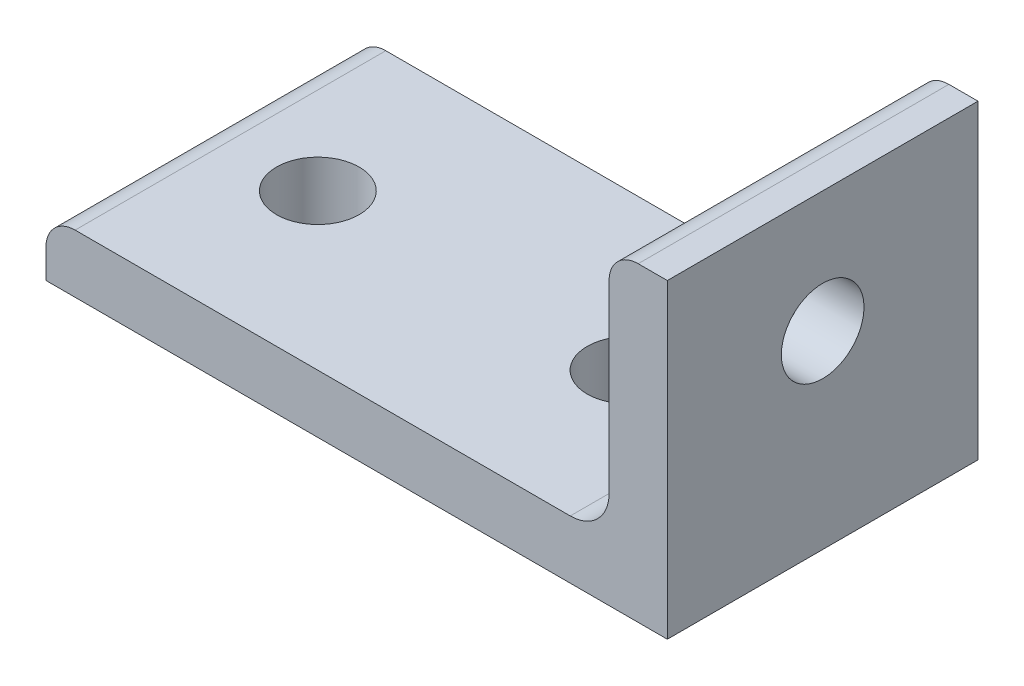
ISO-10303-21;
HEADER;
FILE_DESCRIPTION(('STEP AP214'),'2;1');
FILE_NAME('part.step','',(''),(''),'','','');
FILE_SCHEMA(('AUTOMOTIVE_DESIGN { 1 0 10303 214 1 1 1 1 }'));
ENDSEC;
DATA;
#1=APPLICATION_CONTEXT('core data for automotive mechanical design processes');
#2=APPLICATION_PROTOCOL_DEFINITION('international standard','automotive_design',2000,#1);
#3=PRODUCT_CONTEXT('',#1,'mechanical');
#4=PRODUCT('Part','Part','',(#3));
#5=PRODUCT_RELATED_PRODUCT_CATEGORY('part','',(#4));
#6=PRODUCT_DEFINITION_FORMATION('','',#4);
#7=PRODUCT_DEFINITION_CONTEXT('part definition',#1,'design');
#8=PRODUCT_DEFINITION('design','',#6,#7);
#9=PRODUCT_DEFINITION_SHAPE('','',#8);
#10=(LENGTH_UNIT() NAMED_UNIT(*) SI_UNIT(.MILLI.,.METRE.));
#11=(NAMED_UNIT(*) PLANE_ANGLE_UNIT() SI_UNIT($,.RADIAN.));
#12=(NAMED_UNIT(*) SI_UNIT($,.STERADIAN.) SOLID_ANGLE_UNIT());
#13=UNCERTAINTY_MEASURE_WITH_UNIT(LENGTH_MEASURE(1.E-05),#10,'distance_accuracy_value','');
#14=(GEOMETRIC_REPRESENTATION_CONTEXT(3) GLOBAL_UNCERTAINTY_ASSIGNED_CONTEXT((#13)) GLOBAL_UNIT_ASSIGNED_CONTEXT((#10,
#11,#12)) REPRESENTATION_CONTEXT('',''));
#15=CARTESIAN_POINT('',(0.,0.,0.));
#16=DIRECTION('',(0.,0.,1.));
#17=DIRECTION('',(1.,0.,0.));
#18=AXIS2_PLACEMENT_3D('',#15,#16,#17);
#19=CARTESIAN_POINT('',(-25.4,-10.31875,12.7));
#20=DIRECTION('',(1.,0.,0.));
#21=DIRECTION('',(0.,0.,-1.));
#22=AXIS2_PLACEMENT_3D('',#19,#20,#21);
#23=PLANE('',#22);
#24=DIRECTION('',(0.,-1.,0.));
#25=VECTOR('',#24,1.);
#26=CARTESIAN_POINT('',(-25.4,-10.31875,-12.7));
#27=LINE('',#26,#25);
#28=CARTESIAN_POINT('',(-25.4,-10.31875,-12.7));
#29=VERTEX_POINT('',#28);
#30=CARTESIAN_POINT('',(-25.4,-12.7,-12.7));
#31=VERTEX_POINT('',#30);
#32=EDGE_CURVE('E145',#29,#31,#27,.T.);
#33=ORIENTED_EDGE('',*,*,#32,.T.);
#34=DIRECTION('',(0.,0.,-1.));
#35=VECTOR('',#34,1.);
#36=CARTESIAN_POINT('',(-25.4,-12.7,12.7));
#37=LINE('',#36,#35);
#38=CARTESIAN_POINT('',(-25.4,-12.7,12.7));
#39=VERTEX_POINT('',#38);
#40=EDGE_CURVE('E11',#39,#31,#37,.T.);
#41=ORIENTED_EDGE('',*,*,#40,.F.);
#42=DIRECTION('',(0.,-1.,0.));
#43=VECTOR('',#42,1.);
#44=CARTESIAN_POINT('',(-25.4,-10.31875,12.7));
#45=LINE('',#44,#43);
#46=CARTESIAN_POINT('',(-25.4,-10.31875,12.7));
#47=VERTEX_POINT('',#46);
#48=EDGE_CURVE('E162',#47,#39,#45,.T.);
#49=ORIENTED_EDGE('',*,*,#48,.F.);
#50=DIRECTION('',(0.,0.,-1.));
#51=VECTOR('',#50,1.);
#52=CARTESIAN_POINT('',(-25.4,-10.31875,12.7));
#53=LINE('',#52,#51);
#54=EDGE_CURVE('E141',#47,#29,#53,.T.);
#55=ORIENTED_EDGE('',*,*,#54,.T.);
#56=EDGE_LOOP('',(#33,#41,#49,#55));
#57=FACE_BOUND('',#56,.T.);
#58=ADVANCED_FACE('F43',(#57),#23,.F.);
#59=CARTESIAN_POINT('',(-25.4,-12.7,12.7));
#60=DIRECTION('',(0.,1.,0.));
#61=DIRECTION('',(-1.,0.,0.));
#62=AXIS2_PLACEMENT_3D('',#59,#60,#61);
#63=PLANE('',#62);
#64=CARTESIAN_POINT('',(-15.875,-12.7,0.));
#65=DIRECTION('',(0.,1.,0.));
#66=DIRECTION('',(0.,0.,1.));
#67=AXIS2_PLACEMENT_3D('',#64,#65,#66);
#68=CIRCLE('',#67,3.3782);
#69=CARTESIAN_POINT('',(-15.875,-12.7,3.3782));
#70=VERTEX_POINT('',#69);
#71=EDGE_CURVE('E214',#70,#70,#68,.T.);
#72=ORIENTED_EDGE('',*,*,#71,.T.);
#73=EDGE_LOOP('',(#72));
#74=FACE_BOUND('',#73,.T.);
#75=CARTESIAN_POINT('',(9.525,-12.7,0.));
#76=DIRECTION('',(0.,1.,0.));
#77=DIRECTION('',(0.,0.,1.));
#78=AXIS2_PLACEMENT_3D('',#75,#76,#77);
#79=CIRCLE('',#78,3.3782);
#80=CARTESIAN_POINT('',(9.525,-12.7,3.3782));
#81=VERTEX_POINT('',#80);
#82=EDGE_CURVE('E208',#81,#81,#79,.T.);
#83=ORIENTED_EDGE('',*,*,#82,.T.);
#84=EDGE_LOOP('',(#83));
#85=FACE_BOUND('',#84,.T.);
#86=DIRECTION('',(1.,0.,0.));
#87=VECTOR('',#86,1.);
#88=CARTESIAN_POINT('',(-25.4,-12.7,-12.7));
#89=LINE('',#88,#87);
#90=CARTESIAN_POINT('',(25.4,-12.7,-12.7));
#91=VERTEX_POINT('',#90);
#92=EDGE_CURVE('E148',#31,#91,#89,.T.);
#93=ORIENTED_EDGE('',*,*,#92,.T.);
#94=DIRECTION('',(0.,0.,-1.));
#95=VECTOR('',#94,1.);
#96=CARTESIAN_POINT('',(25.4,-12.7,12.7));
#97=LINE('',#96,#95);
#98=CARTESIAN_POINT('',(25.4,-12.7,12.7));
#99=VERTEX_POINT('',#98);
#100=EDGE_CURVE('E51',#99,#91,#97,.T.);
#101=ORIENTED_EDGE('',*,*,#100,.F.);
#102=DIRECTION('',(1.,0.,0.));
#103=VECTOR('',#102,1.);
#104=CARTESIAN_POINT('',(-25.4,-12.7,12.7));
#105=LINE('',#104,#103);
#106=EDGE_CURVE('E105',#39,#99,#105,.T.);
#107=ORIENTED_EDGE('',*,*,#106,.F.);
#108=ORIENTED_EDGE('',*,*,#40,.T.);
#109=EDGE_LOOP('',(#93,#101,#107,#108));
#110=FACE_BOUND('',#109,.T.);
#111=ADVANCED_FACE('F244',(#74,#85,#110),#63,.F.);
#112=CARTESIAN_POINT('',(25.4,-12.7,12.7));
#113=DIRECTION('',(-1.,0.,0.));
#114=DIRECTION('',(0.,-1.,0.));
#115=AXIS2_PLACEMENT_3D('',#112,#113,#114);
#116=PLANE('',#115);
#117=CARTESIAN_POINT('',(25.4,2.778125,0.));
#118=DIRECTION('',(-1.,0.,0.));
#119=DIRECTION('',(0.,0.,1.));
#120=AXIS2_PLACEMENT_3D('',#117,#118,#119);
#121=CIRCLE('',#120,3.3782);
#122=CARTESIAN_POINT('',(25.4,2.778125,3.3782));
#123=VERTEX_POINT('',#122);
#124=EDGE_CURVE('E149',#123,#123,#121,.T.);
#125=ORIENTED_EDGE('',*,*,#124,.T.);
#126=EDGE_LOOP('',(#125));
#127=FACE_BOUND('',#126,.T.);
#128=DIRECTION('',(0.,1.,0.));
#129=VECTOR('',#128,1.);
#130=CARTESIAN_POINT('',(25.4,-12.7,-12.7));
#131=LINE('',#130,#129);
#132=CARTESIAN_POINT('',(25.4,12.7,-12.7));
#133=VERTEX_POINT('',#132);
#134=EDGE_CURVE('E151',#91,#133,#131,.T.);
#135=ORIENTED_EDGE('',*,*,#134,.T.);
#136=DIRECTION('',(0.,0.,-1.));
#137=VECTOR('',#136,1.);
#138=CARTESIAN_POINT('',(25.4,12.7,12.7));
#139=LINE('',#138,#137);
#140=CARTESIAN_POINT('',(25.4,12.7,12.7));
#141=VERTEX_POINT('',#140);
#142=EDGE_CURVE('E172',#141,#133,#139,.T.);
#143=ORIENTED_EDGE('',*,*,#142,.F.);
#144=DIRECTION('',(0.,1.,0.));
#145=VECTOR('',#144,1.);
#146=CARTESIAN_POINT('',(25.4,-12.7,12.7));
#147=LINE('',#146,#145);
#148=EDGE_CURVE('E180',#99,#141,#147,.T.);
#149=ORIENTED_EDGE('',*,*,#148,.F.);
#150=ORIENTED_EDGE('',*,*,#100,.T.);
#151=EDGE_LOOP('',(#135,#143,#149,#150));
#152=FACE_BOUND('',#151,.T.);
#153=ADVANCED_FACE('F178',(#127,#152),#116,.F.);
#154=CARTESIAN_POINT('',(23.01875,12.7,12.7));
#155=DIRECTION('',(0.,-1.,0.));
#156=DIRECTION('',(0.,0.,-1.));
#157=AXIS2_PLACEMENT_3D('',#154,#155,#156);
#158=PLANE('',#157);
#159=DIRECTION('',(-1.,0.,0.));
#160=VECTOR('',#159,1.);
#161=CARTESIAN_POINT('',(23.01875,12.7,-12.7));
#162=LINE('',#161,#160);
#163=CARTESIAN_POINT('',(23.01875,12.7,-12.7));
#164=VERTEX_POINT('',#163);
#165=EDGE_CURVE('E153',#133,#164,#162,.T.);
#166=ORIENTED_EDGE('',*,*,#165,.T.);
#167=DIRECTION('',(0.,0.,-1.));
#168=VECTOR('',#167,1.);
#169=CARTESIAN_POINT('',(23.01875,12.7,12.7));
#170=LINE('',#169,#168);
#171=CARTESIAN_POINT('',(23.01875,12.7,12.7));
#172=VERTEX_POINT('',#171);
#173=EDGE_CURVE('E169',#172,#164,#170,.T.);
#174=ORIENTED_EDGE('',*,*,#173,.F.);
#175=DIRECTION('',(-1.,0.,0.));
#176=VECTOR('',#175,1.);
#177=CARTESIAN_POINT('',(23.01875,12.7,12.7));
#178=LINE('',#177,#176);
#179=EDGE_CURVE('E196',#141,#172,#178,.T.);
#180=ORIENTED_EDGE('',*,*,#179,.F.);
#181=ORIENTED_EDGE('',*,*,#142,.T.);
#182=EDGE_LOOP('',(#166,#174,#180,#181));
#183=FACE_BOUND('',#182,.T.);
#184=ADVANCED_FACE('F189',(#183),#158,.F.);
#185=CARTESIAN_POINT('',(23.01875,10.31875,12.7));
#186=DIRECTION('',(0.,0.,-1.));
#187=DIRECTION('',(-1.,0.,0.));
#188=AXIS2_PLACEMENT_3D('',#185,#186,#187);
#189=CYLINDRICAL_SURFACE('',#188,2.38125);
#190=CARTESIAN_POINT('',(23.01875,10.31875,-12.7));
#191=DIRECTION('',(0.,0.,1.));
#192=DIRECTION('',(-1.,0.,0.));
#193=AXIS2_PLACEMENT_3D('',#190,#191,#192);
#194=CIRCLE('',#193,2.38125);
#195=CARTESIAN_POINT('',(20.6375,10.31875,-12.7));
#196=VERTEX_POINT('',#195);
#197=EDGE_CURVE('E155',#164,#196,#194,.T.);
#198=ORIENTED_EDGE('',*,*,#197,.T.);
#199=DIRECTION('',(0.,0.,-1.));
#200=VECTOR('',#199,1.);
#201=CARTESIAN_POINT('',(20.6375,10.31875,12.7));
#202=LINE('',#201,#200);
#203=CARTESIAN_POINT('',(20.6375,10.31875,12.7));
#204=VERTEX_POINT('',#203);
#205=EDGE_CURVE('E166',#204,#196,#202,.T.);
#206=ORIENTED_EDGE('',*,*,#205,.F.);
#207=CARTESIAN_POINT('',(23.01875,10.31875,12.7));
#208=DIRECTION('',(0.,0.,1.));
#209=DIRECTION('',(-1.,0.,0.));
#210=AXIS2_PLACEMENT_3D('',#207,#208,#209);
#211=CIRCLE('',#210,2.38125);
#212=EDGE_CURVE('E195',#172,#204,#211,.T.);
#213=ORIENTED_EDGE('',*,*,#212,.F.);
#214=ORIENTED_EDGE('',*,*,#173,.T.);
#215=EDGE_LOOP('',(#198,#206,#213,#214));
#216=FACE_BOUND('',#215,.T.);
#217=ADVANCED_FACE('F193',(#216),#189,.T.);
#218=CARTESIAN_POINT('',(20.6375,10.31875,12.7));
#219=DIRECTION('',(1.,0.,0.));
#220=DIRECTION('',(0.,0.,-1.));
#221=AXIS2_PLACEMENT_3D('',#218,#219,#220);
#222=PLANE('',#221);
#223=CARTESIAN_POINT('',(20.6375,2.778125,0.));
#224=DIRECTION('',(-1.,0.,0.));
#225=DIRECTION('',(0.,0.,1.));
#226=AXIS2_PLACEMENT_3D('',#223,#224,#225);
#227=CIRCLE('',#226,3.3782);
#228=CARTESIAN_POINT('',(20.6375,2.778125,3.3782));
#229=VERTEX_POINT('',#228);
#230=EDGE_CURVE('E205',#229,#229,#227,.T.);
#231=ORIENTED_EDGE('',*,*,#230,.F.);
#232=EDGE_LOOP('',(#231));
#233=FACE_BOUND('',#232,.T.);
#234=DIRECTION('',(0.,-1.,0.));
#235=VECTOR('',#234,1.);
#236=CARTESIAN_POINT('',(20.6375,10.31875,-12.7));
#237=LINE('',#236,#235);
#238=CARTESIAN_POINT('',(20.6375,-4.7625,-12.7));
#239=VERTEX_POINT('',#238);
#240=EDGE_CURVE('E157',#196,#239,#237,.T.);
#241=ORIENTED_EDGE('',*,*,#240,.T.);
#242=DIRECTION('',(0.,0.,-1.));
#243=VECTOR('',#242,1.);
#244=CARTESIAN_POINT('',(20.6375,-4.7625,12.7));
#245=LINE('',#244,#243);
#246=CARTESIAN_POINT('',(20.6375,-4.7625,12.7));
#247=VERTEX_POINT('',#246);
#248=EDGE_CURVE('E136',#247,#239,#245,.T.);
#249=ORIENTED_EDGE('',*,*,#248,.F.);
#250=DIRECTION('',(0.,-1.,0.));
#251=VECTOR('',#250,1.);
#252=CARTESIAN_POINT('',(20.6375,10.31875,12.7));
#253=LINE('',#252,#251);
#254=EDGE_CURVE('E127',#204,#247,#253,.T.);
#255=ORIENTED_EDGE('',*,*,#254,.F.);
#256=ORIENTED_EDGE('',*,*,#205,.T.);
#257=EDGE_LOOP('',(#241,#249,#255,#256));
#258=FACE_BOUND('',#257,.T.);
#259=ADVANCED_FACE('F254',(#233,#258),#222,.F.);
#260=CARTESIAN_POINT('',(17.4625,-4.7625,12.7));
#261=DIRECTION('',(0.,0.,-1.));
#262=DIRECTION('',(-1.,0.,0.));
#263=AXIS2_PLACEMENT_3D('',#260,#261,#262);
#264=CYLINDRICAL_SURFACE('',#263,3.175);
#265=CARTESIAN_POINT('',(17.4625,-4.7625,-12.7));
#266=DIRECTION('',(0.,0.,-1.));
#267=DIRECTION('',(-1.,0.,0.));
#268=AXIS2_PLACEMENT_3D('',#265,#266,#267);
#269=CIRCLE('',#268,3.175);
#270=CARTESIAN_POINT('',(17.4625,-7.9375,-12.7));
#271=VERTEX_POINT('',#270);
#272=EDGE_CURVE('E135',#239,#271,#269,.T.);
#273=ORIENTED_EDGE('',*,*,#272,.T.);
#274=DIRECTION('',(0.,0.,-1.));
#275=VECTOR('',#274,1.);
#276=CARTESIAN_POINT('',(17.4625,-7.9375,12.7));
#277=LINE('',#276,#275);
#278=CARTESIAN_POINT('',(17.4625,-7.9375,12.7));
#279=VERTEX_POINT('',#278);
#280=EDGE_CURVE('E132',#279,#271,#277,.T.);
#281=ORIENTED_EDGE('',*,*,#280,.F.);
#282=CARTESIAN_POINT('',(17.4625,-4.7625,12.7));
#283=DIRECTION('',(0.,0.,-1.));
#284=DIRECTION('',(-1.,0.,0.));
#285=AXIS2_PLACEMENT_3D('',#282,#283,#284);
#286=CIRCLE('',#285,3.175);
#287=EDGE_CURVE('E121',#247,#279,#286,.T.);
#288=ORIENTED_EDGE('',*,*,#287,.F.);
#289=ORIENTED_EDGE('',*,*,#248,.T.);
#290=EDGE_LOOP('',(#273,#281,#288,#289));
#291=FACE_BOUND('',#290,.T.);
#292=ADVANCED_FACE('F133',(#291),#264,.F.);
#293=CARTESIAN_POINT('',(17.4625,-7.9375,12.7));
#294=DIRECTION('',(0.,-1.,0.));
#295=DIRECTION('',(1.,0.,0.));
#296=AXIS2_PLACEMENT_3D('',#293,#294,#295);
#297=PLANE('',#296);
#298=CARTESIAN_POINT('',(-15.875,-7.9375,0.));
#299=DIRECTION('',(0.,1.,0.));
#300=DIRECTION('',(0.,0.,1.));
#301=AXIS2_PLACEMENT_3D('',#298,#299,#300);
#302=CIRCLE('',#301,3.37819999999999);
#303=CARTESIAN_POINT('',(-15.875,-7.9375,3.37819999999999));
#304=VERTEX_POINT('',#303);
#305=EDGE_CURVE('E217',#304,#304,#302,.T.);
#306=ORIENTED_EDGE('',*,*,#305,.F.);
#307=EDGE_LOOP('',(#306));
#308=FACE_BOUND('',#307,.T.);
#309=CARTESIAN_POINT('',(9.525,-7.9375,0.));
#310=DIRECTION('',(0.,1.,0.));
#311=DIRECTION('',(0.,0.,1.));
#312=AXIS2_PLACEMENT_3D('',#309,#310,#311);
#313=CIRCLE('',#312,3.37819999999999);
#314=CARTESIAN_POINT('',(9.525,-7.9375,3.37819999999999));
#315=VERTEX_POINT('',#314);
#316=EDGE_CURVE('E211',#315,#315,#313,.T.);
#317=ORIENTED_EDGE('',*,*,#316,.F.);
#318=EDGE_LOOP('',(#317));
#319=FACE_BOUND('',#318,.T.);
#320=DIRECTION('',(-1.,0.,0.));
#321=VECTOR('',#320,1.);
#322=CARTESIAN_POINT('',(17.4625,-7.9375,-12.7));
#323=LINE('',#322,#321);
#324=CARTESIAN_POINT('',(-23.01875,-7.9375,-12.7));
#325=VERTEX_POINT('',#324);
#326=EDGE_CURVE('E91',#271,#325,#323,.T.);
#327=ORIENTED_EDGE('',*,*,#326,.T.);
#328=DIRECTION('',(0.,0.,-1.));
#329=VECTOR('',#328,1.);
#330=CARTESIAN_POINT('',(-23.01875,-7.9375,12.7));
#331=LINE('',#330,#329);
#332=CARTESIAN_POINT('',(-23.01875,-7.9375,12.7));
#333=VERTEX_POINT('',#332);
#334=EDGE_CURVE('E137',#333,#325,#331,.T.);
#335=ORIENTED_EDGE('',*,*,#334,.F.);
#336=DIRECTION('',(-1.,0.,0.));
#337=VECTOR('',#336,1.);
#338=CARTESIAN_POINT('',(17.4625,-7.9375,12.7));
#339=LINE('',#338,#337);
#340=EDGE_CURVE('E125',#279,#333,#339,.T.);
#341=ORIENTED_EDGE('',*,*,#340,.F.);
#342=ORIENTED_EDGE('',*,*,#280,.T.);
#343=EDGE_LOOP('',(#327,#335,#341,#342));
#344=FACE_BOUND('',#343,.T.);
#345=ADVANCED_FACE('F139',(#308,#319,#344),#297,.F.);
#346=CARTESIAN_POINT('',(-23.01875,-10.31875,12.7));
#347=DIRECTION('',(0.,0.,-1.));
#348=DIRECTION('',(-1.,0.,0.));
#349=AXIS2_PLACEMENT_3D('',#346,#347,#348);
#350=CYLINDRICAL_SURFACE('',#349,2.38125);
#351=CARTESIAN_POINT('',(-23.01875,-10.31875,-12.7));
#352=DIRECTION('',(0.,0.,1.));
#353=DIRECTION('',(-1.,0.,0.));
#354=AXIS2_PLACEMENT_3D('',#351,#352,#353);
#355=CIRCLE('',#354,2.38125);
#356=EDGE_CURVE('E97',#325,#29,#355,.T.);
#357=ORIENTED_EDGE('',*,*,#356,.T.);
#358=ORIENTED_EDGE('',*,*,#54,.F.);
#359=CARTESIAN_POINT('',(-23.01875,-10.31875,12.7));
#360=DIRECTION('',(0.,0.,1.));
#361=DIRECTION('',(-1.,0.,0.));
#362=AXIS2_PLACEMENT_3D('',#359,#360,#361);
#363=CIRCLE('',#362,2.38125);
#364=EDGE_CURVE('E59',#333,#47,#363,.T.);
#365=ORIENTED_EDGE('',*,*,#364,.F.);
#366=ORIENTED_EDGE('',*,*,#334,.T.);
#367=EDGE_LOOP('',(#357,#358,#365,#366));
#368=FACE_BOUND('',#367,.T.);
#369=ADVANCED_FACE('F225',(#368),#350,.T.);
#370=CARTESIAN_POINT('',(23.01875,10.31875,12.7));
#371=DIRECTION('',(0.,0.,-1.));
#372=DIRECTION('',(-1.,0.,0.));
#373=AXIS2_PLACEMENT_3D('',#370,#371,#372);
#374=PLANE('',#373);
#375=ORIENTED_EDGE('',*,*,#48,.T.);
#376=ORIENTED_EDGE('',*,*,#106,.T.);
#377=ORIENTED_EDGE('',*,*,#148,.T.);
#378=ORIENTED_EDGE('',*,*,#179,.T.);
#379=ORIENTED_EDGE('',*,*,#212,.T.);
#380=ORIENTED_EDGE('',*,*,#254,.T.);
#381=ORIENTED_EDGE('',*,*,#287,.T.);
#382=ORIENTED_EDGE('',*,*,#340,.T.);
#383=ORIENTED_EDGE('',*,*,#364,.T.);
#384=EDGE_LOOP('',(#375,#376,#377,#378,#379,#380,#381,#382,#383));
#385=FACE_BOUND('',#384,.T.);
#386=ADVANCED_FACE('F123',(#385),#374,.F.);
#387=CARTESIAN_POINT('',(23.01875,10.31875,-12.7));
#388=DIRECTION('',(0.,0.,-1.));
#389=DIRECTION('',(-1.,0.,0.));
#390=AXIS2_PLACEMENT_3D('',#387,#388,#389);
#391=PLANE('',#390);
#392=ORIENTED_EDGE('',*,*,#32,.F.);
#393=ORIENTED_EDGE('',*,*,#356,.F.);
#394=ORIENTED_EDGE('',*,*,#326,.F.);
#395=ORIENTED_EDGE('',*,*,#272,.F.);
#396=ORIENTED_EDGE('',*,*,#240,.F.);
#397=ORIENTED_EDGE('',*,*,#197,.F.);
#398=ORIENTED_EDGE('',*,*,#165,.F.);
#399=ORIENTED_EDGE('',*,*,#134,.F.);
#400=ORIENTED_EDGE('',*,*,#92,.F.);
#401=EDGE_LOOP('',(#392,#393,#394,#395,#396,#397,#398,#399,#400));
#402=FACE_BOUND('',#401,.T.);
#403=ADVANCED_FACE('F184',(#402),#391,.T.);
#404=CARTESIAN_POINT('',(20.6375,2.778125,0.));
#405=DIRECTION('',(-1.,0.,0.));
#406=DIRECTION('',(0.,0.,1.));
#407=AXIS2_PLACEMENT_3D('',#404,#405,#406);
#408=CYLINDRICAL_SURFACE('',#407,3.3782);
#409=ORIENTED_EDGE('',*,*,#124,.F.);
#410=EDGE_LOOP('',(#409));
#411=FACE_BOUND('',#410,.T.);
#412=ORIENTED_EDGE('',*,*,#230,.T.);
#413=EDGE_LOOP('',(#412));
#414=FACE_BOUND('',#413,.T.);
#415=ADVANCED_FACE('F231',(#411,#414),#408,.F.);
#416=CARTESIAN_POINT('',(9.525,-7.9375,0.));
#417=DIRECTION('',(0.,1.,0.));
#418=DIRECTION('',(0.,0.,1.));
#419=AXIS2_PLACEMENT_3D('',#416,#417,#418);
#420=CYLINDRICAL_SURFACE('',#419,3.37819999999999);
#421=ORIENTED_EDGE('',*,*,#82,.F.);
#422=EDGE_LOOP('',(#421));
#423=FACE_BOUND('',#422,.T.);
#424=ORIENTED_EDGE('',*,*,#316,.T.);
#425=EDGE_LOOP('',(#424));
#426=FACE_BOUND('',#425,.T.);
#427=ADVANCED_FACE('F229',(#423,#426),#420,.F.);
#428=CARTESIAN_POINT('',(-15.875,-7.9375,0.));
#429=DIRECTION('',(0.,1.,0.));
#430=DIRECTION('',(0.,0.,1.));
#431=AXIS2_PLACEMENT_3D('',#428,#429,#430);
#432=CYLINDRICAL_SURFACE('',#431,3.37819999999999);
#433=ORIENTED_EDGE('',*,*,#71,.F.);
#434=EDGE_LOOP('',(#433));
#435=FACE_BOUND('',#434,.T.);
#436=ORIENTED_EDGE('',*,*,#305,.T.);
#437=EDGE_LOOP('',(#436));
#438=FACE_BOUND('',#437,.T.);
#439=ADVANCED_FACE('F221',(#435,#438),#432,.F.);
#440=CLOSED_SHELL('',(#58,#111,#153,#184,#217,#259,#292,#345,#369,#386,#403,#415,#427,#439));
#441=MANIFOLD_SOLID_BREP('B2',#440);
#442=ADVANCED_BREP_SHAPE_REPRESENTATION('',(#18,#441),#14);
#443=SHAPE_DEFINITION_REPRESENTATION(#9,#442);
ENDSEC;
END-ISO-10303-21;
